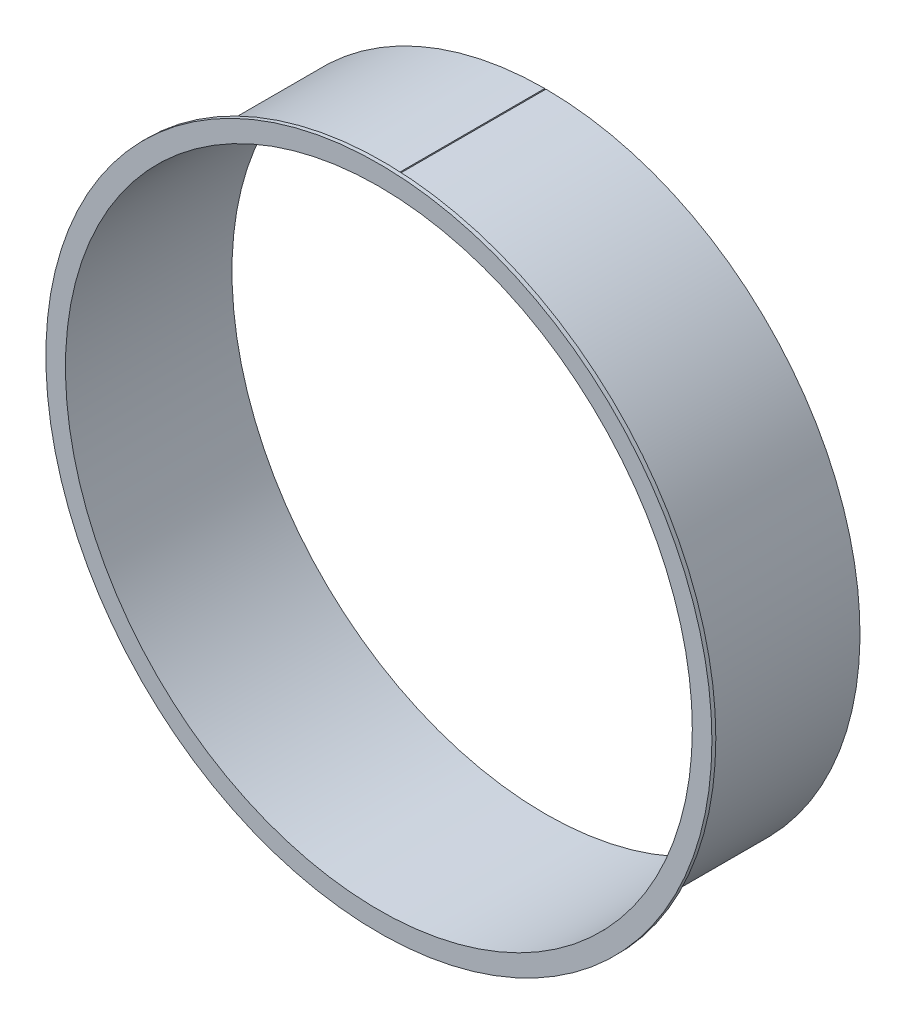
ISO-10303-21;
HEADER;
FILE_DESCRIPTION(('STEP AP214'),'2;1');
FILE_NAME('part.step','',(''),(''),'','','');
FILE_SCHEMA(('AUTOMOTIVE_DESIGN { 1 0 10303 214 1 1 1 1 }'));
ENDSEC;
DATA;
#1=APPLICATION_CONTEXT('core data for automotive mechanical design processes');
#2=APPLICATION_PROTOCOL_DEFINITION('international standard','automotive_design',2000,#1);
#3=PRODUCT_CONTEXT('',#1,'mechanical');
#4=PRODUCT('Part','Part','',(#3));
#5=PRODUCT_RELATED_PRODUCT_CATEGORY('part','',(#4));
#6=PRODUCT_DEFINITION_FORMATION('','',#4);
#7=PRODUCT_DEFINITION_CONTEXT('part definition',#1,'design');
#8=PRODUCT_DEFINITION('design','',#6,#7);
#9=PRODUCT_DEFINITION_SHAPE('','',#8);
#10=(LENGTH_UNIT() NAMED_UNIT(*) SI_UNIT(.MILLI.,.METRE.));
#11=(NAMED_UNIT(*) PLANE_ANGLE_UNIT() SI_UNIT($,.RADIAN.));
#12=(NAMED_UNIT(*) SI_UNIT($,.STERADIAN.) SOLID_ANGLE_UNIT());
#13=UNCERTAINTY_MEASURE_WITH_UNIT(LENGTH_MEASURE(1.E-05),#10,'distance_accuracy_value','');
#14=(GEOMETRIC_REPRESENTATION_CONTEXT(3) GLOBAL_UNCERTAINTY_ASSIGNED_CONTEXT((#13)) GLOBAL_UNIT_ASSIGNED_CONTEXT((#10,
#11,#12)) REPRESENTATION_CONTEXT('',''));
#15=CARTESIAN_POINT('',(0.,0.,0.));
#16=DIRECTION('',(0.,0.,1.));
#17=DIRECTION('',(1.,0.,0.));
#18=AXIS2_PLACEMENT_3D('',#15,#16,#17);
#19=CARTESIAN_POINT('',(0.,0.,207.5));
#20=DIRECTION('',(0.,0.,-1.));
#21=DIRECTION('',(-1.,0.,0.));
#22=AXIS2_PLACEMENT_3D('',#19,#20,#21);
#23=CYLINDRICAL_SURFACE('',#22,803.);
#24=CARTESIAN_POINT('',(0.,0.,-207.5));
#25=DIRECTION('',(0.,0.,1.));
#26=DIRECTION('',(1.,0.,0.));
#27=AXIS2_PLACEMENT_3D('',#24,#25,#26);
#28=CIRCLE('',#27,803.);
#29=CARTESIAN_POINT('',(-1.50562499999998,802.998588475322,-207.5));
#30=VERTEX_POINT('',#29);
#31=CARTESIAN_POINT('',(1.50562499999972,802.998588475322,-207.5));
#32=VERTEX_POINT('',#31);
#33=EDGE_CURVE('E98',#30,#32,#28,.T.);
#34=ORIENTED_EDGE('',*,*,#33,.T.);
#35=DIRECTION('',(0.,0.,-1.));
#36=VECTOR('',#35,1.);
#37=CARTESIAN_POINT('',(1.50562499999972,802.998588475322,207.5));
#38=LINE('',#37,#36);
#39=CARTESIAN_POINT('',(1.50562499999972,802.998588475322,207.5));
#40=VERTEX_POINT('',#39);
#41=EDGE_CURVE('E12',#40,#32,#38,.T.);
#42=ORIENTED_EDGE('',*,*,#41,.F.);
#43=CARTESIAN_POINT('',(0.,0.,207.5));
#44=DIRECTION('',(0.,0.,1.));
#45=DIRECTION('',(1.,0.,0.));
#46=AXIS2_PLACEMENT_3D('',#43,#44,#45);
#47=CIRCLE('',#46,803.);
#48=CARTESIAN_POINT('',(-1.50562499999998,802.998588475322,207.5));
#49=VERTEX_POINT('',#48);
#50=EDGE_CURVE('E99',#49,#40,#47,.T.);
#51=ORIENTED_EDGE('',*,*,#50,.F.);
#52=DIRECTION('',(0.,0.,-1.));
#53=VECTOR('',#52,1.);
#54=CARTESIAN_POINT('',(-1.50562499999998,802.998588475322,207.5));
#55=LINE('',#54,#53);
#56=EDGE_CURVE('E83',#49,#30,#55,.T.);
#57=ORIENTED_EDGE('',*,*,#56,.T.);
#58=EDGE_LOOP('',(#34,#42,#51,#57));
#59=FACE_BOUND('',#58,.T.);
#60=ADVANCED_FACE('F44',(#59),#23,.T.);
#61=CARTESIAN_POINT('',(1.49999999999972,799.998593748764,207.5));
#62=DIRECTION('',(-0.999998242185955,0.00187499999999963,0.));
#63=DIRECTION('',(-0.00187499999999963,-0.999998242185955,0.));
#64=AXIS2_PLACEMENT_3D('',#61,#62,#63);
#65=PLANE('',#64);
#66=DIRECTION('',(0.00187499999999963,0.999998242185955,0.));
#67=VECTOR('',#66,1.);
#68=CARTESIAN_POINT('',(1.49999999999972,799.998593748764,-207.5));
#69=LINE('',#68,#67);
#70=CARTESIAN_POINT('',(1.49999999999972,799.998593748764,-207.5));
#71=VERTEX_POINT('',#70);
#72=EDGE_CURVE('E93',#71,#32,#69,.T.);
#73=ORIENTED_EDGE('',*,*,#72,.F.);
#74=DIRECTION('',(0.,0.,-1.));
#75=VECTOR('',#74,1.);
#76=CARTESIAN_POINT('',(1.49999999999972,799.998593748764,207.5));
#77=LINE('',#76,#75);
#78=CARTESIAN_POINT('',(1.49999999999972,799.998593748764,207.5));
#79=VERTEX_POINT('',#78);
#80=EDGE_CURVE('E52',#79,#71,#77,.T.);
#81=ORIENTED_EDGE('',*,*,#80,.F.);
#82=DIRECTION('',(0.00187499999999963,0.999998242185955,0.));
#83=VECTOR('',#82,1.);
#84=CARTESIAN_POINT('',(1.49999999999972,799.998593748764,207.5));
#85=LINE('',#84,#83);
#86=EDGE_CURVE('E102',#79,#40,#85,.T.);
#87=ORIENTED_EDGE('',*,*,#86,.T.);
#88=ORIENTED_EDGE('',*,*,#41,.T.);
#89=EDGE_LOOP('',(#73,#81,#87,#88));
#90=FACE_BOUND('',#89,.T.);
#91=ADVANCED_FACE('F114',(#90),#65,.T.);
#92=CARTESIAN_POINT('',(0.,0.,207.5));
#93=DIRECTION('',(0.,0.,-1.));
#94=DIRECTION('',(-1.,0.,0.));
#95=AXIS2_PLACEMENT_3D('',#92,#93,#94);
#96=CYLINDRICAL_SURFACE('',#95,800.);
#97=CARTESIAN_POINT('',(0.,0.,-207.5));
#98=DIRECTION('',(0.,0.,1.));
#99=DIRECTION('',(1.,0.,0.));
#100=AXIS2_PLACEMENT_3D('',#97,#98,#99);
#101=CIRCLE('',#100,800.);
#102=CARTESIAN_POINT('',(-1.49999999999998,799.998593748764,-207.5));
#103=VERTEX_POINT('',#102);
#104=EDGE_CURVE('E86',#103,#71,#101,.T.);
#105=ORIENTED_EDGE('',*,*,#104,.F.);
#106=DIRECTION('',(0.,0.,-1.));
#107=VECTOR('',#106,1.);
#108=CARTESIAN_POINT('',(-1.49999999999998,799.998593748764,207.5));
#109=LINE('',#108,#107);
#110=CARTESIAN_POINT('',(-1.49999999999998,799.998593748764,207.5));
#111=VERTEX_POINT('',#110);
#112=EDGE_CURVE('E75',#111,#103,#109,.T.);
#113=ORIENTED_EDGE('',*,*,#112,.F.);
#114=CARTESIAN_POINT('',(0.,0.,207.5));
#115=DIRECTION('',(0.,0.,1.));
#116=DIRECTION('',(1.,0.,0.));
#117=AXIS2_PLACEMENT_3D('',#114,#115,#116);
#118=CIRCLE('',#117,800.);
#119=EDGE_CURVE('E59',#79,#111,#118,.T.);
#120=ORIENTED_EDGE('',*,*,#119,.F.);
#121=ORIENTED_EDGE('',*,*,#80,.T.);
#122=EDGE_LOOP('',(#105,#113,#120,#121));
#123=FACE_BOUND('',#122,.T.);
#124=CARTESIAN_POINT('',(0.,0.,217.5));
#125=DIRECTION('',(0.,0.,1.));
#126=DIRECTION('',(1.,0.,0.));
#127=AXIS2_PLACEMENT_3D('',#124,#125,#126);
#128=CIRCLE('',#127,800.);
#129=CARTESIAN_POINT('',(800.,0.,217.5));
#130=VERTEX_POINT('',#129);
#131=EDGE_CURVE('E147',#130,#130,#128,.T.);
#132=ORIENTED_EDGE('',*,*,#131,.T.);
#133=EDGE_LOOP('',(#132));
#134=FACE_BOUND('',#133,.T.);
#135=ADVANCED_FACE('F87',(#123,#134),#96,.F.);
#136=CARTESIAN_POINT('',(-1.50562499999998,802.998588475322,207.5));
#137=DIRECTION('',(0.999998242185955,0.00187499999999999,0.));
#138=DIRECTION('',(-0.00187499999999999,0.999998242185955,0.));
#139=AXIS2_PLACEMENT_3D('',#136,#137,#138);
#140=PLANE('',#139);
#141=DIRECTION('',(0.00187499999999999,-0.999998242185955,0.));
#142=VECTOR('',#141,1.);
#143=CARTESIAN_POINT('',(-1.50562499999998,802.998588475322,-207.5));
#144=LINE('',#143,#142);
#145=EDGE_CURVE('E80',#30,#103,#144,.T.);
#146=ORIENTED_EDGE('',*,*,#145,.F.);
#147=ORIENTED_EDGE('',*,*,#56,.F.);
#148=DIRECTION('',(0.00187499999999999,-0.999998242185955,0.));
#149=VECTOR('',#148,1.);
#150=CARTESIAN_POINT('',(-1.50562499999998,802.998588475322,207.5));
#151=LINE('',#150,#149);
#152=EDGE_CURVE('E81',#49,#111,#151,.T.);
#153=ORIENTED_EDGE('',*,*,#152,.T.);
#154=ORIENTED_EDGE('',*,*,#112,.T.);
#155=EDGE_LOOP('',(#146,#147,#153,#154));
#156=FACE_BOUND('',#155,.T.);
#157=ADVANCED_FACE('F77',(#156),#140,.T.);
#158=CARTESIAN_POINT('',(0.,0.,-207.5));
#159=DIRECTION('',(0.,0.,1.));
#160=DIRECTION('',(1.,0.,0.));
#161=AXIS2_PLACEMENT_3D('',#158,#159,#160);
#162=PLANE('',#161);
#163=ORIENTED_EDGE('',*,*,#33,.F.);
#164=ORIENTED_EDGE('',*,*,#145,.T.);
#165=ORIENTED_EDGE('',*,*,#104,.T.);
#166=ORIENTED_EDGE('',*,*,#72,.T.);
#167=EDGE_LOOP('',(#163,#164,#165,#166));
#168=FACE_BOUND('',#167,.T.);
#169=ADVANCED_FACE('F96',(#168),#162,.F.);
#170=CARTESIAN_POINT('',(0.,0.,217.5));
#171=DIRECTION('',(0.,0.,1.));
#172=DIRECTION('',(1.,0.,0.));
#173=AXIS2_PLACEMENT_3D('',#170,#171,#172);
#174=PLANE('',#173);
#175=CARTESIAN_POINT('',(0.,0.,217.5));
#176=DIRECTION('',(0.,0.,1.));
#177=DIRECTION('',(1.,0.,0.));
#178=AXIS2_PLACEMENT_3D('',#175,#176,#177);
#179=CIRCLE('',#178,850.);
#180=CARTESIAN_POINT('',(850.,0.,217.5));
#181=VERTEX_POINT('',#180);
#182=EDGE_CURVE('E112',#181,#181,#179,.T.);
#183=ORIENTED_EDGE('',*,*,#182,.T.);
#184=EDGE_LOOP('',(#183));
#185=FACE_BOUND('',#184,.T.);
#186=ORIENTED_EDGE('',*,*,#131,.F.);
#187=EDGE_LOOP('',(#186));
#188=FACE_BOUND('',#187,.T.);
#189=ADVANCED_FACE('F130',(#185,#188),#174,.T.);
#190=CARTESIAN_POINT('',(0.,0.,207.5));
#191=DIRECTION('',(0.,0.,1.));
#192=DIRECTION('',(1.,0.,0.));
#193=AXIS2_PLACEMENT_3D('',#190,#191,#192);
#194=PLANE('',#193);
#195=ORIENTED_EDGE('',*,*,#86,.F.);
#196=ORIENTED_EDGE('',*,*,#119,.T.);
#197=ORIENTED_EDGE('',*,*,#152,.F.);
#198=ORIENTED_EDGE('',*,*,#50,.T.);
#199=EDGE_LOOP('',(#195,#196,#197,#198));
#200=FACE_BOUND('',#199,.T.);
#201=CARTESIAN_POINT('',(0.,0.,207.5));
#202=DIRECTION('',(0.,0.,1.));
#203=DIRECTION('',(1.,0.,0.));
#204=AXIS2_PLACEMENT_3D('',#201,#202,#203);
#205=CIRCLE('',#204,850.);
#206=CARTESIAN_POINT('',(850.,0.,207.5));
#207=VERTEX_POINT('',#206);
#208=EDGE_CURVE('E148',#207,#207,#205,.T.);
#209=ORIENTED_EDGE('',*,*,#208,.F.);
#210=EDGE_LOOP('',(#209));
#211=FACE_BOUND('',#210,.T.);
#212=ADVANCED_FACE('F134',(#200,#211),#194,.F.);
#213=CARTESIAN_POINT('',(0.,0.,217.5));
#214=DIRECTION('',(0.,0.,-1.));
#215=DIRECTION('',(-1.,0.,0.));
#216=AXIS2_PLACEMENT_3D('',#213,#214,#215);
#217=CYLINDRICAL_SURFACE('',#216,850.);
#218=ORIENTED_EDGE('',*,*,#182,.F.);
#219=EDGE_LOOP('',(#218));
#220=FACE_BOUND('',#219,.T.);
#221=ORIENTED_EDGE('',*,*,#208,.T.);
#222=EDGE_LOOP('',(#221));
#223=FACE_BOUND('',#222,.T.);
#224=ADVANCED_FACE('F131',(#220,#223),#217,.T.);
#225=CLOSED_SHELL('',(#60,#91,#135,#157,#169,#189,#212,#224));
#226=MANIFOLD_SOLID_BREP('B2',#225);
#227=ADVANCED_BREP_SHAPE_REPRESENTATION('',(#18,#226),#14);
#228=SHAPE_DEFINITION_REPRESENTATION(#9,#227);
ENDSEC;
END-ISO-10303-21;
